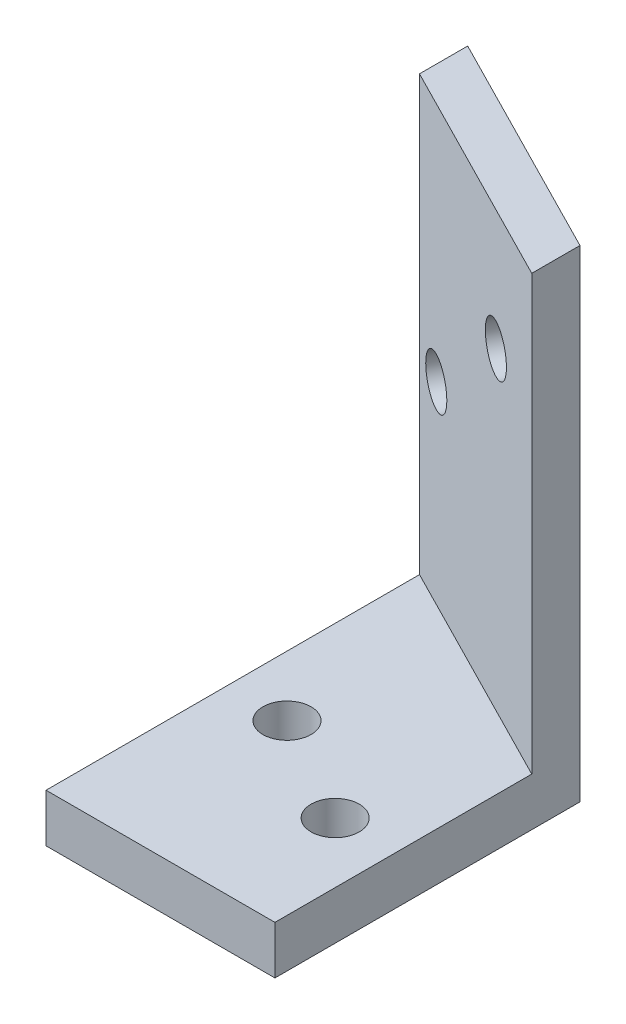
ISO-10303-21;
HEADER;
FILE_DESCRIPTION(('STEP AP214'),'2;1');
FILE_NAME('part.step','',(''),(''),'','','');
FILE_SCHEMA(('AUTOMOTIVE_DESIGN { 1 0 10303 214 1 1 1 1 }'));
ENDSEC;
DATA;
#1=APPLICATION_CONTEXT('core data for automotive mechanical design processes');
#2=APPLICATION_PROTOCOL_DEFINITION('international standard','automotive_design',2000,#1);
#3=PRODUCT_CONTEXT('',#1,'mechanical');
#4=PRODUCT('Part','Part','',(#3));
#5=PRODUCT_RELATED_PRODUCT_CATEGORY('part','',(#4));
#6=PRODUCT_DEFINITION_FORMATION('','',#4);
#7=PRODUCT_DEFINITION_CONTEXT('part definition',#1,'design');
#8=PRODUCT_DEFINITION('design','',#6,#7);
#9=PRODUCT_DEFINITION_SHAPE('','',#8);
#10=(LENGTH_UNIT() NAMED_UNIT(*) SI_UNIT(.MILLI.,.METRE.));
#11=(NAMED_UNIT(*) PLANE_ANGLE_UNIT() SI_UNIT($,.RADIAN.));
#12=(NAMED_UNIT(*) SI_UNIT($,.STERADIAN.) SOLID_ANGLE_UNIT());
#13=UNCERTAINTY_MEASURE_WITH_UNIT(LENGTH_MEASURE(1.E-05),#10,'distance_accuracy_value','');
#14=(GEOMETRIC_REPRESENTATION_CONTEXT(3) GLOBAL_UNCERTAINTY_ASSIGNED_CONTEXT((#13)) GLOBAL_UNIT_ASSIGNED_CONTEXT((#10,
#11,#12)) REPRESENTATION_CONTEXT('',''));
#15=CARTESIAN_POINT('',(0.,0.,0.));
#16=DIRECTION('',(0.,0.,1.));
#17=DIRECTION('',(1.,0.,0.));
#18=AXIS2_PLACEMENT_3D('',#15,#16,#17);
#19=CARTESIAN_POINT('',(0.,4.,0.));
#20=DIRECTION('',(0.,-1.,0.));
#21=DIRECTION('',(0.,0.,-1.));
#22=AXIS2_PLACEMENT_3D('',#19,#20,#21);
#23=PLANE('',#22);
#24=CARTESIAN_POINT('',(-4.5,4.,2.5));
#25=DIRECTION('',(0.,1.,0.));
#26=DIRECTION('',(0.,0.,1.));
#27=AXIS2_PLACEMENT_3D('',#24,#25,#26);
#28=CIRCLE('',#27,2.);
#29=CARTESIAN_POINT('',(-4.5,4.,4.5));
#30=VERTEX_POINT('',#29);
#31=EDGE_CURVE('E340',#30,#30,#28,.T.);
#32=ORIENTED_EDGE('',*,*,#31,.F.);
#33=EDGE_LOOP('',(#32));
#34=FACE_BOUND('',#33,.T.);
#35=CARTESIAN_POINT('',(4.5,4.,7.5));
#36=DIRECTION('',(0.,1.,0.));
#37=DIRECTION('',(0.,0.,1.));
#38=AXIS2_PLACEMENT_3D('',#35,#36,#37);
#39=CIRCLE('',#38,2.);
#40=CARTESIAN_POINT('',(4.5,4.,9.5));
#41=VERTEX_POINT('',#40);
#42=EDGE_CURVE('E342',#41,#41,#39,.T.);
#43=ORIENTED_EDGE('',*,*,#42,.F.);
#44=EDGE_LOOP('',(#43));
#45=FACE_BOUND('',#44,.T.);
#46=DIRECTION('',(0.891006524188366,0.,0.453990499739551));
#47=VECTOR('',#46,1.);
#48=CARTESIAN_POINT('',(9.5,4.,-3.81901645960575));
#49=LINE('',#48,#47);
#50=CARTESIAN_POINT('',(-9.5,4.,-13.5));
#51=VERTEX_POINT('',#50);
#52=CARTESIAN_POINT('',(9.5,4.,-3.81901645960575));
#53=VERTEX_POINT('',#52);
#54=EDGE_CURVE('E61',#51,#53,#49,.T.);
#55=ORIENTED_EDGE('',*,*,#54,.F.);
#56=DIRECTION('',(0.,0.,1.));
#57=VECTOR('',#56,1.);
#58=CARTESIAN_POINT('',(-9.5,4.,17.5));
#59=LINE('',#58,#57);
#60=CARTESIAN_POINT('',(-9.5,4.,17.5));
#61=VERTEX_POINT('',#60);
#62=EDGE_CURVE('E122',#51,#61,#59,.T.);
#63=ORIENTED_EDGE('',*,*,#62,.T.);
#64=DIRECTION('',(1.,0.,0.));
#65=VECTOR('',#64,1.);
#66=CARTESIAN_POINT('',(-9.5,4.,17.5));
#67=LINE('',#66,#65);
#68=CARTESIAN_POINT('',(9.5,4.,17.5));
#69=VERTEX_POINT('',#68);
#70=EDGE_CURVE('E141',#61,#69,#67,.T.);
#71=ORIENTED_EDGE('',*,*,#70,.T.);
#72=DIRECTION('',(0.,0.,-1.));
#73=VECTOR('',#72,1.);
#74=CARTESIAN_POINT('',(9.5,4.,17.5));
#75=LINE('',#74,#73);
#76=EDGE_CURVE('E135',#69,#53,#75,.T.);
#77=ORIENTED_EDGE('',*,*,#76,.T.);
#78=EDGE_LOOP('',(#55,#63,#71,#77));
#79=FACE_BOUND('',#78,.T.);
#80=ADVANCED_FACE('F43',(#34,#45,#79),#23,.F.);
#81=CARTESIAN_POINT('',(9.5,4.,17.5));
#82=DIRECTION('',(-1.,0.,0.));
#83=DIRECTION('',(0.,0.,1.));
#84=AXIS2_PLACEMENT_3D('',#81,#82,#83);
#85=PLANE('',#84);
#86=DIRECTION('',(0.,0.,-1.));
#87=VECTOR('',#86,1.);
#88=CARTESIAN_POINT('',(9.5,0.,17.5));
#89=LINE('',#88,#87);
#90=CARTESIAN_POINT('',(9.5,0.,17.5));
#91=VERTEX_POINT('',#90);
#92=CARTESIAN_POINT('',(9.5,0.,-7.81901645960575));
#93=VERTEX_POINT('',#92);
#94=EDGE_CURVE('E134',#91,#93,#89,.T.);
#95=ORIENTED_EDGE('',*,*,#94,.T.);
#96=DIRECTION('',(0.,1.,0.));
#97=VECTOR('',#96,1.);
#98=CARTESIAN_POINT('',(9.5,0.,-7.81901645960575));
#99=LINE('',#98,#97);
#100=CARTESIAN_POINT('',(9.5,40.,-7.81901645960575));
#101=VERTEX_POINT('',#100);
#102=EDGE_CURVE('E69',#93,#101,#99,.T.);
#103=ORIENTED_EDGE('',*,*,#102,.T.);
#104=DIRECTION('',(0.,0.,-1.));
#105=VECTOR('',#104,1.);
#106=CARTESIAN_POINT('',(9.5,40.,-7.81901645960575));
#107=LINE('',#106,#105);
#108=CARTESIAN_POINT('',(9.5,40.,-3.81901645960575));
#109=VERTEX_POINT('',#108);
#110=EDGE_CURVE('E110',#109,#101,#107,.T.);
#111=ORIENTED_EDGE('',*,*,#110,.F.);
#112=DIRECTION('',(0.,-1.,0.));
#113=VECTOR('',#112,1.);
#114=CARTESIAN_POINT('',(9.5,40.,-3.81901645960575));
#115=LINE('',#114,#113);
#116=EDGE_CURVE('E105',#109,#53,#115,.T.);
#117=ORIENTED_EDGE('',*,*,#116,.T.);
#118=ORIENTED_EDGE('',*,*,#76,.F.);
#119=DIRECTION('',(0.,-1.,0.));
#120=VECTOR('',#119,1.);
#121=CARTESIAN_POINT('',(9.5,4.,17.5));
#122=LINE('',#121,#120);
#123=EDGE_CURVE('E144',#69,#91,#122,.T.);
#124=ORIENTED_EDGE('',*,*,#123,.T.);
#125=EDGE_LOOP('',(#95,#103,#111,#117,#118,#124));
#126=FACE_BOUND('',#125,.T.);
#127=ADVANCED_FACE('F45',(#126),#85,.F.);
#128=CARTESIAN_POINT('',(-9.5,4.,17.5));
#129=DIRECTION('',(1.,0.,0.));
#130=DIRECTION('',(0.,0.,-1.));
#131=AXIS2_PLACEMENT_3D('',#128,#129,#130);
#132=PLANE('',#131);
#133=DIRECTION('',(0.,0.,1.));
#134=VECTOR('',#133,1.);
#135=CARTESIAN_POINT('',(-9.5,0.,17.5));
#136=LINE('',#135,#134);
#137=CARTESIAN_POINT('',(-9.5,0.,-17.5));
#138=VERTEX_POINT('',#137);
#139=CARTESIAN_POINT('',(-9.5,0.,17.5));
#140=VERTEX_POINT('',#139);
#141=EDGE_CURVE('E148',#138,#140,#136,.T.);
#142=ORIENTED_EDGE('',*,*,#141,.T.);
#143=DIRECTION('',(0.,-1.,0.));
#144=VECTOR('',#143,1.);
#145=CARTESIAN_POINT('',(-9.5,4.,17.5));
#146=LINE('',#145,#144);
#147=EDGE_CURVE('E53',#61,#140,#146,.T.);
#148=ORIENTED_EDGE('',*,*,#147,.F.);
#149=ORIENTED_EDGE('',*,*,#62,.F.);
#150=DIRECTION('',(0.,-1.,0.));
#151=VECTOR('',#150,1.);
#152=CARTESIAN_POINT('',(-9.5,40.,-13.5));
#153=LINE('',#152,#151);
#154=CARTESIAN_POINT('',(-9.5,40.,-13.5));
#155=VERTEX_POINT('',#154);
#156=EDGE_CURVE('E103',#155,#51,#153,.T.);
#157=ORIENTED_EDGE('',*,*,#156,.F.);
#158=DIRECTION('',(0.,0.,1.));
#159=VECTOR('',#158,1.);
#160=CARTESIAN_POINT('',(-9.5,40.,-13.5));
#161=LINE('',#160,#159);
#162=CARTESIAN_POINT('',(-9.5,40.,-17.5));
#163=VERTEX_POINT('',#162);
#164=EDGE_CURVE('E111',#163,#155,#161,.T.);
#165=ORIENTED_EDGE('',*,*,#164,.F.);
#166=DIRECTION('',(0.,-1.,0.));
#167=VECTOR('',#166,1.);
#168=CARTESIAN_POINT('',(-9.5,4.,-17.5));
#169=LINE('',#168,#167);
#170=EDGE_CURVE('E11',#163,#138,#169,.T.);
#171=ORIENTED_EDGE('',*,*,#170,.T.);
#172=EDGE_LOOP('',(#142,#148,#149,#157,#165,#171));
#173=FACE_BOUND('',#172,.T.);
#174=ADVANCED_FACE('F120',(#173),#132,.F.);
#175=CARTESIAN_POINT('',(-9.5,4.,17.5));
#176=DIRECTION('',(0.,0.,-1.));
#177=DIRECTION('',(-1.,0.,0.));
#178=AXIS2_PLACEMENT_3D('',#175,#176,#177);
#179=PLANE('',#178);
#180=DIRECTION('',(1.,0.,0.));
#181=VECTOR('',#180,1.);
#182=CARTESIAN_POINT('',(-9.5,0.,17.5));
#183=LINE('',#182,#181);
#184=EDGE_CURVE('E138',#140,#91,#183,.T.);
#185=ORIENTED_EDGE('',*,*,#184,.T.);
#186=ORIENTED_EDGE('',*,*,#123,.F.);
#187=ORIENTED_EDGE('',*,*,#70,.F.);
#188=ORIENTED_EDGE('',*,*,#147,.T.);
#189=EDGE_LOOP('',(#185,#186,#187,#188));
#190=FACE_BOUND('',#189,.T.);
#191=ADVANCED_FACE('F194',(#190),#179,.F.);
#192=CARTESIAN_POINT('',(0.,0.,0.));
#193=DIRECTION('',(0.,-1.,0.));
#194=DIRECTION('',(0.,0.,-1.));
#195=AXIS2_PLACEMENT_3D('',#192,#193,#194);
#196=PLANE('',#195);
#197=CARTESIAN_POINT('',(-4.5,0.,2.5));
#198=DIRECTION('',(0.,1.,0.));
#199=DIRECTION('',(0.,0.,1.));
#200=AXIS2_PLACEMENT_3D('',#197,#198,#199);
#201=CIRCLE('',#200,2.);
#202=CARTESIAN_POINT('',(-4.5,0.,4.5));
#203=VERTEX_POINT('',#202);
#204=EDGE_CURVE('E174',#203,#203,#201,.T.);
#205=ORIENTED_EDGE('',*,*,#204,.T.);
#206=EDGE_LOOP('',(#205));
#207=FACE_BOUND('',#206,.T.);
#208=CARTESIAN_POINT('',(4.5,0.,7.5));
#209=DIRECTION('',(0.,1.,0.));
#210=DIRECTION('',(0.,0.,1.));
#211=AXIS2_PLACEMENT_3D('',#208,#209,#210);
#212=CIRCLE('',#211,2.);
#213=CARTESIAN_POINT('',(4.5,0.,9.5));
#214=VERTEX_POINT('',#213);
#215=EDGE_CURVE('E177',#214,#214,#212,.T.);
#216=ORIENTED_EDGE('',*,*,#215,.T.);
#217=EDGE_LOOP('',(#216));
#218=FACE_BOUND('',#217,.T.);
#219=DIRECTION('',(0.891006524188366,0.,0.453990499739551));
#220=VECTOR('',#219,1.);
#221=CARTESIAN_POINT('',(-9.5,0.,-17.5));
#222=LINE('',#221,#220);
#223=EDGE_CURVE('E124',#138,#93,#222,.T.);
#224=ORIENTED_EDGE('',*,*,#223,.T.);
#225=ORIENTED_EDGE('',*,*,#94,.F.);
#226=ORIENTED_EDGE('',*,*,#184,.F.);
#227=ORIENTED_EDGE('',*,*,#141,.F.);
#228=EDGE_LOOP('',(#224,#225,#226,#227));
#229=FACE_BOUND('',#228,.T.);
#230=ADVANCED_FACE('F190',(#207,#218,#229),#196,.T.);
#231=CARTESIAN_POINT('',(-9.5,0.,-17.5));
#232=DIRECTION('',(-0.453990499739551,0.,0.891006524188366));
#233=DIRECTION('',(0.891006524188366,0.,0.453990499739551));
#234=AXIS2_PLACEMENT_3D('',#231,#232,#233);
#235=PLANE('',#234);
#236=CARTESIAN_POINT('',(5.04496737905817,30.,-10.0889689583035));
#237=DIRECTION('',(0.453990499739551,0.,-0.891006524188366));
#238=DIRECTION('',(-0.891006524188366,0.,-0.453990499739551));
#239=AXIS2_PLACEMENT_3D('',#236,#237,#238);
#240=CIRCLE('',#239,2.);
#241=CARTESIAN_POINT('',(3.26295433068144,30.,-10.9969499577826));
#242=VERTEX_POINT('',#241);
#243=EDGE_CURVE('E161',#242,#242,#240,.T.);
#244=ORIENTED_EDGE('',*,*,#243,.F.);
#245=EDGE_LOOP('',(#244));
#246=FACE_BOUND('',#245,.T.);
#247=CARTESIAN_POINT('',(-5.04496737905817,20.,-15.2300475013023));
#248=DIRECTION('',(0.453990499739551,0.,-0.891006524188366));
#249=DIRECTION('',(-0.891006524188366,0.,-0.453990499739551));
#250=AXIS2_PLACEMENT_3D('',#247,#248,#249);
#251=CIRCLE('',#250,2.);
#252=CARTESIAN_POINT('',(-6.8269804274349,20.,-16.1380285007814));
#253=VERTEX_POINT('',#252);
#254=EDGE_CURVE('E168',#253,#253,#251,.T.);
#255=ORIENTED_EDGE('',*,*,#254,.F.);
#256=EDGE_LOOP('',(#255));
#257=FACE_BOUND('',#256,.T.);
#258=ORIENTED_EDGE('',*,*,#170,.F.);
#259=DIRECTION('',(-0.891006524188366,0.,-0.453990499739551));
#260=VECTOR('',#259,1.);
#261=CARTESIAN_POINT('',(-9.5,40.,-17.5));
#262=LINE('',#261,#260);
#263=EDGE_CURVE('E116',#101,#163,#262,.T.);
#264=ORIENTED_EDGE('',*,*,#263,.F.);
#265=ORIENTED_EDGE('',*,*,#102,.F.);
#266=ORIENTED_EDGE('',*,*,#223,.F.);
#267=EDGE_LOOP('',(#258,#264,#265,#266));
#268=FACE_BOUND('',#267,.T.);
#269=ADVANCED_FACE('F186',(#246,#257,#268),#235,.F.);
#270=CARTESIAN_POINT('',(9.5,40.,-3.81901645960575));
#271=DIRECTION('',(0.453990499739551,0.,-0.891006524188366));
#272=DIRECTION('',(-0.891006524188366,0.,-0.453990499739551));
#273=AXIS2_PLACEMENT_3D('',#270,#271,#272);
#274=PLANE('',#273);
#275=CARTESIAN_POINT('',(3.42693339030827,30.,-6.91339845371857));
#276=DIRECTION('',(0.453990499739551,0.,-0.891006524188366));
#277=DIRECTION('',(-0.891006524188366,0.,-0.453990499739551));
#278=AXIS2_PLACEMENT_3D('',#275,#276,#277);
#279=CIRCLE('',#278,2.);
#280=CARTESIAN_POINT('',(1.64492034193153,30.,-7.82137945319768));
#281=VERTEX_POINT('',#280);
#282=EDGE_CURVE('E47',#281,#281,#279,.T.);
#283=ORIENTED_EDGE('',*,*,#282,.T.);
#284=EDGE_LOOP('',(#283));
#285=FACE_BOUND('',#284,.T.);
#286=CARTESIAN_POINT('',(-6.66300136780808,20.,-12.0544769967173));
#287=DIRECTION('',(0.453990499739551,0.,-0.891006524188366));
#288=DIRECTION('',(-0.891006524188366,0.,-0.453990499739551));
#289=AXIS2_PLACEMENT_3D('',#286,#287,#288);
#290=CIRCLE('',#289,2.);
#291=CARTESIAN_POINT('',(-8.44501441618481,20.,-12.9624579961964));
#292=VERTEX_POINT('',#291);
#293=EDGE_CURVE('E158',#292,#292,#290,.T.);
#294=ORIENTED_EDGE('',*,*,#293,.T.);
#295=EDGE_LOOP('',(#294));
#296=FACE_BOUND('',#295,.T.);
#297=ORIENTED_EDGE('',*,*,#54,.T.);
#298=ORIENTED_EDGE('',*,*,#116,.F.);
#299=DIRECTION('',(0.891006524188366,0.,0.453990499739551));
#300=VECTOR('',#299,1.);
#301=CARTESIAN_POINT('',(9.5,40.,-3.81901645960575));
#302=LINE('',#301,#300);
#303=EDGE_CURVE('E99',#155,#109,#302,.T.);
#304=ORIENTED_EDGE('',*,*,#303,.F.);
#305=ORIENTED_EDGE('',*,*,#156,.T.);
#306=EDGE_LOOP('',(#297,#298,#304,#305));
#307=FACE_BOUND('',#306,.T.);
#308=ADVANCED_FACE('F101',(#285,#296,#307),#274,.F.);
#309=CARTESIAN_POINT('',(0.,40.,0.));
#310=DIRECTION('',(0.,-1.,0.));
#311=DIRECTION('',(0.,0.,-1.));
#312=AXIS2_PLACEMENT_3D('',#309,#310,#311);
#313=PLANE('',#312);
#314=ORIENTED_EDGE('',*,*,#164,.T.);
#315=ORIENTED_EDGE('',*,*,#303,.T.);
#316=ORIENTED_EDGE('',*,*,#110,.T.);
#317=ORIENTED_EDGE('',*,*,#263,.T.);
#318=EDGE_LOOP('',(#314,#315,#316,#317));
#319=FACE_BOUND('',#318,.T.);
#320=ADVANCED_FACE('F115',(#319),#313,.F.);
#321=CARTESIAN_POINT('',(-19.2027647806199,20.,12.5561944138159));
#322=DIRECTION('',(0.453990499739551,0.,-0.891006524188366));
#323=DIRECTION('',(-0.891006524188366,0.,-0.453990499739551));
#324=AXIS2_PLACEMENT_3D('',#321,#322,#323);
#325=CYLINDRICAL_SURFACE('',#324,2.);
#326=ORIENTED_EDGE('',*,*,#254,.T.);
#327=EDGE_LOOP('',(#326));
#328=FACE_BOUND('',#327,.T.);
#329=ORIENTED_EDGE('',*,*,#293,.F.);
#330=EDGE_LOOP('',(#329));
#331=FACE_BOUND('',#330,.T.);
#332=ADVANCED_FACE('F244',(#328,#331),#325,.F.);
#333=CARTESIAN_POINT('',(-9.1128300225035,30.,17.6972729568147));
#334=DIRECTION('',(0.453990499739551,0.,-0.891006524188366));
#335=DIRECTION('',(-0.891006524188366,0.,-0.453990499739551));
#336=AXIS2_PLACEMENT_3D('',#333,#334,#335);
#337=CYLINDRICAL_SURFACE('',#336,2.);
#338=ORIENTED_EDGE('',*,*,#243,.T.);
#339=EDGE_LOOP('',(#338));
#340=FACE_BOUND('',#339,.T.);
#341=ORIENTED_EDGE('',*,*,#282,.F.);
#342=EDGE_LOOP('',(#341));
#343=FACE_BOUND('',#342,.T.);
#344=ADVANCED_FACE('F250',(#340,#343),#337,.F.);
#345=CARTESIAN_POINT('',(4.5,0.,7.5));
#346=DIRECTION('',(0.,1.,0.));
#347=DIRECTION('',(0.,0.,1.));
#348=AXIS2_PLACEMENT_3D('',#345,#346,#347);
#349=CYLINDRICAL_SURFACE('',#348,2.);
#350=ORIENTED_EDGE('',*,*,#215,.F.);
#351=EDGE_LOOP('',(#350));
#352=FACE_BOUND('',#351,.T.);
#353=ORIENTED_EDGE('',*,*,#42,.T.);
#354=EDGE_LOOP('',(#353));
#355=FACE_BOUND('',#354,.T.);
#356=ADVANCED_FACE('F258',(#352,#355),#349,.F.);
#357=CARTESIAN_POINT('',(-4.5,0.,2.5));
#358=DIRECTION('',(0.,1.,0.));
#359=DIRECTION('',(0.,0.,1.));
#360=AXIS2_PLACEMENT_3D('',#357,#358,#359);
#361=CYLINDRICAL_SURFACE('',#360,2.);
#362=ORIENTED_EDGE('',*,*,#204,.F.);
#363=EDGE_LOOP('',(#362));
#364=FACE_BOUND('',#363,.T.);
#365=ORIENTED_EDGE('',*,*,#31,.T.);
#366=EDGE_LOOP('',(#365));
#367=FACE_BOUND('',#366,.T.);
#368=ADVANCED_FACE('F264',(#364,#367),#361,.F.);
#369=CLOSED_SHELL('',(#80,#127,#174,#191,#230,#269,#308,#320,#332,#344,#356,#368));
#370=MANIFOLD_SOLID_BREP('B2',#369);
#371=ADVANCED_BREP_SHAPE_REPRESENTATION('',(#18,#370),#14);
#372=SHAPE_DEFINITION_REPRESENTATION(#9,#371);
ENDSEC;
END-ISO-10303-21;
